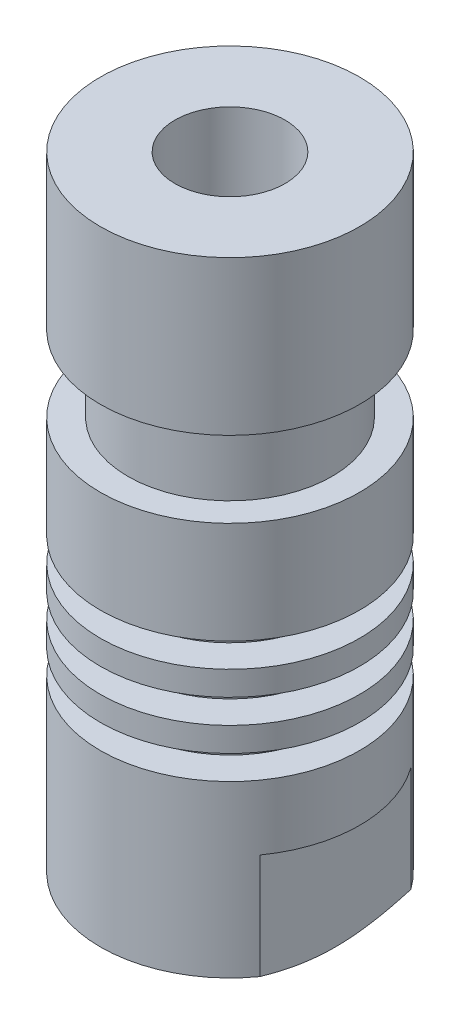
ISO-10303-21;
HEADER;
FILE_DESCRIPTION(('STEP AP214'),'2;1');
FILE_NAME('part.step','',(''),(''),'','','');
FILE_SCHEMA(('AUTOMOTIVE_DESIGN { 1 0 10303 214 1 1 1 1 }'));
ENDSEC;
DATA;
#1=APPLICATION_CONTEXT('core data for automotive mechanical design processes');
#2=APPLICATION_PROTOCOL_DEFINITION('international standard','automotive_design',2000,#1);
#3=PRODUCT_CONTEXT('',#1,'mechanical');
#4=PRODUCT('Part','Part','',(#3));
#5=PRODUCT_RELATED_PRODUCT_CATEGORY('part','',(#4));
#6=PRODUCT_DEFINITION_FORMATION('','',#4);
#7=PRODUCT_DEFINITION_CONTEXT('part definition',#1,'design');
#8=PRODUCT_DEFINITION('design','',#6,#7);
#9=PRODUCT_DEFINITION_SHAPE('','',#8);
#10=(LENGTH_UNIT() NAMED_UNIT(*) SI_UNIT(.MILLI.,.METRE.));
#11=(NAMED_UNIT(*) PLANE_ANGLE_UNIT() SI_UNIT($,.RADIAN.));
#12=(NAMED_UNIT(*) SI_UNIT($,.STERADIAN.) SOLID_ANGLE_UNIT());
#13=UNCERTAINTY_MEASURE_WITH_UNIT(LENGTH_MEASURE(1.E-05),#10,'distance_accuracy_value','');
#14=(GEOMETRIC_REPRESENTATION_CONTEXT(3) GLOBAL_UNCERTAINTY_ASSIGNED_CONTEXT((#13)) GLOBAL_UNIT_ASSIGNED_CONTEXT((#10,
#11,#12)) REPRESENTATION_CONTEXT('',''));
#15=CARTESIAN_POINT('',(0.,0.,0.));
#16=DIRECTION('',(0.,0.,1.));
#17=DIRECTION('',(1.,0.,0.));
#18=AXIS2_PLACEMENT_3D('',#15,#16,#17);
#19=CARTESIAN_POINT('',(0.,1.5,0.));
#20=DIRECTION('',(0.,1.,0.));
#21=DIRECTION('',(0.,0.,1.));
#22=AXIS2_PLACEMENT_3D('',#19,#20,#21);
#23=CONICAL_SURFACE('',#22,7.99999999999999,1.10714871779409);
#24=CARTESIAN_POINT('',(0.,0.,0.));
#25=DIRECTION('',(0.,1.,0.));
#26=DIRECTION('',(0.,0.,1.));
#27=AXIS2_PLACEMENT_3D('',#24,#25,#26);
#28=CIRCLE('',#27,4.99999999999998);
#29=CARTESIAN_POINT('',(0.,0.,4.99999999999998));
#30=VERTEX_POINT('',#29);
#31=EDGE_CURVE('E11',#30,#30,#28,.T.);
#32=ORIENTED_EDGE('',*,*,#31,.T.);
#33=EDGE_LOOP('',(#32));
#34=FACE_BOUND('',#33,.T.);
#35=CARTESIAN_POINT('',(0.,1.5,0.));
#36=DIRECTION('',(0.,1.,0.));
#37=DIRECTION('',(0.,0.,1.));
#38=AXIS2_PLACEMENT_3D('',#35,#36,#37);
#39=CIRCLE('',#38,7.99999999999999);
#40=CARTESIAN_POINT('',(6.49999999999997,1.5,-4.66368952654442));
#41=VERTEX_POINT('',#40);
#42=CARTESIAN_POINT('',(-6.49999999999997,1.5,-4.66368952654442));
#43=VERTEX_POINT('',#42);
#44=EDGE_CURVE('E90',#41,#43,#39,.T.);
#45=ORIENTED_EDGE('',*,*,#44,.F.);
#46=CARTESIAN_POINT('',(6.49999999999999,4.63960517836139,-12.7140020611741));
#47=CARTESIAN_POINT('',(6.49999999999999,4.49493273691476,-12.3889791438294));
#48=CARTESIAN_POINT('',(6.49999999999999,4.35117750702607,-12.0635434352985));
#49=CARTESIAN_POINT('',(6.49999999999999,4.06600795170587,-11.4116234990025));
#50=CARTESIAN_POINT('',(6.49999999999999,3.92459377917146,-11.0851392044028));
#51=CARTESIAN_POINT('',(6.49999999999999,3.64433543055072,-10.4302489102803));
#52=CARTESIAN_POINT('',(6.49999999999999,3.50549732908588,-10.1018403056813));
#53=CARTESIAN_POINT('',(6.49999999999999,3.23142571950738,-9.44352872623451));
#54=CARTESIAN_POINT('',(6.49999999999999,3.09619212071106,-9.11362578922609));
#55=CARTESIAN_POINT('',(6.49999999999999,2.83048289305682,-8.45250376338199));
#56=CARTESIAN_POINT('',(6.49999999999999,2.70000014874712,-8.1212875425723));
#57=CARTESIAN_POINT('',(6.49999999999999,2.44483186701764,-7.45659634827722));
#58=CARTESIAN_POINT('',(6.49999999999999,2.32014667007343,-7.12312124344747));
#59=CARTESIAN_POINT('',(6.49999999999999,2.07840099908306,-6.45372644486896));
#60=CARTESIAN_POINT('',(6.49999999999999,1.96133416663675,-6.11780905674865));
#61=CARTESIAN_POINT('',(6.49999999999999,1.73702665581905,-5.44272397498847));
#62=CARTESIAN_POINT('',(6.49999999999999,1.62978438251793,-5.10355681882979));
#63=CARTESIAN_POINT('',(6.49999999999999,1.50145760944831,-4.66929022803816));
#64=CARTESIAN_POINT('',(6.49999999999999,1.47439812441263,-4.57594563698322));
#65=CARTESIAN_POINT('',(6.49999999999999,1.42132141191772,-4.38896083134469));
#66=CARTESIAN_POINT('',(6.49999999999999,1.39530416853117,-4.29532062130229));
#67=CARTESIAN_POINT('',(6.49999999999999,1.31884649816979,-4.01363447591895));
#68=CARTESIAN_POINT('',(6.49999999999999,1.27009239909997,-3.82513345071698));
#69=CARTESIAN_POINT('',(6.49999999999999,1.13144347216063,-3.25712110004858));
#70=CARTESIAN_POINT('',(6.49999999999999,1.04932049996449,-2.87562365996438));
#71=CARTESIAN_POINT('',(6.49999999999999,0.946261094020701,-2.29977813127616));
#72=CARTESIAN_POINT('',(6.49999999999999,0.915259699355965,-2.10720712065049));
#73=CARTESIAN_POINT('',(6.49999999999999,0.860714592579146,-1.7210183720728));
#74=CARTESIAN_POINT('',(6.49999999999999,0.837170046736164,-1.52740075360301));
#75=CARTESIAN_POINT('',(6.49999999999999,0.798232474629815,-1.13985753736791));
#76=CARTESIAN_POINT('',(6.49999999999999,0.78281812154265,-0.945934097286736));
#77=CARTESIAN_POINT('',(6.49999999999999,0.760510527948946,-0.557594838663115));
#78=CARTESIAN_POINT('',(6.49999999999999,0.753617189046768,-0.36317902583227));
#79=CARTESIAN_POINT('',(6.49999999999999,0.748572275423312,0.0257307608028593));
#80=CARTESIAN_POINT('',(6.49999999999999,0.750419038007415,0.220224712703199));
#81=CARTESIAN_POINT('',(6.49999999999999,0.76278940638265,0.608953775199544));
#82=CARTESIAN_POINT('',(6.49999999999999,0.773314033718197,0.803188852624818));
#83=CARTESIAN_POINT('',(6.49999999999999,0.806501889662758,1.24090602694894));
#84=CARTESIAN_POINT('',(6.49999999999999,0.831590920516133,1.48420561931386));
#85=CARTESIAN_POINT('',(6.49999999999999,0.893852125406739,1.96924724220696));
#86=CARTESIAN_POINT('',(6.49999999999999,0.931025317420886,2.21098913976374));
#87=CARTESIAN_POINT('',(6.49999999999999,1.01604103903786,2.69277716302994));
#88=CARTESIAN_POINT('',(6.49999999999999,1.06389244038228,2.93282170644527));
#89=CARTESIAN_POINT('',(6.49999999999999,1.16871694054054,3.41088019593747));
#90=CARTESIAN_POINT('',(6.49999999999999,1.22568964445531,3.64889422945387));
#91=CARTESIAN_POINT('',(6.49999999999999,1.34820588611418,4.1264246278799));
#92=CARTESIAN_POINT('',(6.49999999999999,1.41386316573231,4.36591159529887));
#93=CARTESIAN_POINT('',(6.49999999999999,1.55170831935892,4.84285142414976));
#94=CARTESIAN_POINT('',(6.49999999999999,1.62389277522808,5.08030527977033));
#95=CARTESIAN_POINT('',(6.49999999999999,1.77367698683179,5.55344813381403));
#96=CARTESIAN_POINT('',(6.49999999999999,1.85127585874316,5.78913741335532));
#97=CARTESIAN_POINT('',(6.49999999999999,2.01097599435672,6.25901728470311));
#98=CARTESIAN_POINT('',(6.49999999999999,2.09307790629008,6.49320765528824));
#99=CARTESIAN_POINT('',(6.49999999999999,2.28703034641471,7.03262988490792));
#100=CARTESIAN_POINT('',(6.49999999999999,2.40021373679549,7.33738166221177));
#101=CARTESIAN_POINT('',(6.49999999999999,2.63161506867892,7.94497276131788));
#102=CARTESIAN_POINT('',(6.49999999999999,2.74983321640616,8.24781200419785));
#103=CARTESIAN_POINT('',(6.49999999999999,2.99028703034095,8.8519169939098));
#104=CARTESIAN_POINT('',(6.49999999999999,3.11252303289466,9.15318260654962));
#105=CARTESIAN_POINT('',(6.49999999999999,3.36022795848007,9.75438363657073));
#106=CARTESIAN_POINT('',(6.49999999999999,3.4856969285348,10.0543190345298));
#107=CARTESIAN_POINT('',(6.49999999999999,3.8662108131295,10.9529295272112));
#108=CARTESIAN_POINT('',(6.49999999999999,4.12517530296346,11.5499439611486));
#109=CARTESIAN_POINT('',(6.49999999999999,4.65016432189855,12.7407935160942));
#110=CARTESIAN_POINT('',(6.49999999999999,4.91618837224115,13.334628849434));
#111=CARTESIAN_POINT('',(6.49999999999999,5.43683739745572,14.4837436524848));
#112=CARTESIAN_POINT('',(6.49999999999999,5.69116368566189,15.0391586745477));
#113=CARTESIAN_POINT('',(6.49999999999999,6.20312748367829,16.148471829484));
#114=CARTESIAN_POINT('',(6.49999999999999,6.46076506083453,16.7023699312269));
#115=CARTESIAN_POINT('',(6.49999999999999,6.97809934492668,17.8080180985776));
#116=CARTESIAN_POINT('',(6.49999999999999,7.23779164660991,18.3597702278274));
#117=CARTESIAN_POINT('',(6.49999999999999,7.75914833515714,19.4623190137403));
#118=CARTESIAN_POINT('',(6.49999999999999,8.02081265352454,20.0131157027799));
#119=CARTESIAN_POINT('',(6.49999999999999,8.28320577924075,20.5635626171586));
#120=B_SPLINE_CURVE_WITH_KNOTS('',3,(#46,#47,#48,#49,#50,#51,#52,#53,#54,#55,#56,#57,#58,#59,
#60,#61,#62,#63,#64,#65,#66,#67,#68,#69,#70,#71,#72,#73,#74,#75,#76,#77,#78,#79,#80,#81,#82,#83,
#84,#85,#86,#87,#88,#89,#90,#91,#92,#93,#94,#95,#96,#97,#98,#99,#100,#101,#102,#103,#104,#105,
#106,#107,#108,#109,#110,#111,#112,#113,#114,#115,#116,#117,#118,#119),.UNSPECIFIED.,.F.,.F.,(4,
2,2,2,2,2,2,2,2,2,2,2,2,2,2,2,2,2,2,2,2,2,2,2,2,2,2,2,2,2,2,2,2,2,2,2,4),(0.,1.06730515758635,
2.13467974924003,3.20431402837473,4.27392137202762,5.34185467005331,6.40985060614332,
7.47694343200911,8.54386271672926,8.83542135077925,9.12697552758702,9.71105511301348,
10.8808525348457,11.4658873460732,12.0508567229673,12.6342839007031,13.2177043413035,
13.8010137979488,14.3843919306593,15.1178129637762,15.8512957967343,16.5853903108169,
17.31945305149,18.0643130987016,18.8087853133975,19.5531362870632,20.2975946957999,
21.2728075860352,22.2480604596634,23.2233951834841,24.1987441014193,26.1509456097113,
28.1030150621006,29.9356240477088,31.7682703646555,33.5977016553134,35.4270696921721),.UNSPECIFIED.);
#121=CARTESIAN_POINT('',(6.49999999999997,1.5,4.66368952654442));
#122=VERTEX_POINT('',#121);
#123=EDGE_CURVE('E75',#122,#41,#120,.F.);
#124=ORIENTED_EDGE('',*,*,#123,.F.);
#125=CARTESIAN_POINT('',(-6.49999999999997,1.5,4.66368952654442));
#126=VERTEX_POINT('',#125);
#127=EDGE_CURVE('E42',#126,#122,#39,.T.);
#128=ORIENTED_EDGE('',*,*,#127,.F.);
#129=CARTESIAN_POINT('',(-6.49999999999999,4.63960517836139,-12.7140020611741));
#130=CARTESIAN_POINT('',(-6.49999999999999,4.49493273691476,-12.3889791438294));
#131=CARTESIAN_POINT('',(-6.49999999999999,4.35117750702607,-12.0635434352985));
#132=CARTESIAN_POINT('',(-6.49999999999999,4.06600795170587,-11.4116234990025));
#133=CARTESIAN_POINT('',(-6.49999999999999,3.92459377917146,-11.0851392044028));
#134=CARTESIAN_POINT('',(-6.49999999999999,3.64433543055072,-10.4302489102803));
#135=CARTESIAN_POINT('',(-6.49999999999999,3.50549732908588,-10.1018403056813));
#136=CARTESIAN_POINT('',(-6.49999999999999,3.23142571950738,-9.44352872623451));
#137=CARTESIAN_POINT('',(-6.49999999999999,3.09619212071106,-9.11362578922609));
#138=CARTESIAN_POINT('',(-6.49999999999999,2.83048289305682,-8.45250376338199));
#139=CARTESIAN_POINT('',(-6.49999999999999,2.70000014874712,-8.1212875425723));
#140=CARTESIAN_POINT('',(-6.49999999999999,2.44483186701764,-7.45659634827722));
#141=CARTESIAN_POINT('',(-6.49999999999999,2.32014667007343,-7.12312124344747));
#142=CARTESIAN_POINT('',(-6.49999999999999,2.07840099908306,-6.45372644486896));
#143=CARTESIAN_POINT('',(-6.49999999999999,1.96133416663675,-6.11780905674865));
#144=CARTESIAN_POINT('',(-6.49999999999999,1.73702665581905,-5.44272397498847));
#145=CARTESIAN_POINT('',(-6.49999999999999,1.62978438251793,-5.10355681882979));
#146=CARTESIAN_POINT('',(-6.49999999999999,1.50145760944831,-4.66929022803816));
#147=CARTESIAN_POINT('',(-6.49999999999999,1.47439812441263,-4.57594563698322));
#148=CARTESIAN_POINT('',(-6.49999999999999,1.42132141191772,-4.38896083134469));
#149=CARTESIAN_POINT('',(-6.49999999999999,1.39530416853117,-4.29532062130229));
#150=CARTESIAN_POINT('',(-6.49999999999999,1.31884649816979,-4.01363447591895));
#151=CARTESIAN_POINT('',(-6.49999999999999,1.27009239909997,-3.82513345071698));
#152=CARTESIAN_POINT('',(-6.49999999999999,1.13144347216063,-3.25712110004858));
#153=CARTESIAN_POINT('',(-6.49999999999999,1.04932049996449,-2.87562365996438));
#154=CARTESIAN_POINT('',(-6.49999999999999,0.946261094020701,-2.29977813127616));
#155=CARTESIAN_POINT('',(-6.49999999999999,0.915259699355965,-2.10720712065049));
#156=CARTESIAN_POINT('',(-6.49999999999999,0.860714592579146,-1.7210183720728));
#157=CARTESIAN_POINT('',(-6.49999999999999,0.837170046736164,-1.52740075360301));
#158=CARTESIAN_POINT('',(-6.49999999999999,0.798232474629815,-1.13985753736791));
#159=CARTESIAN_POINT('',(-6.49999999999999,0.78281812154265,-0.945934097286736));
#160=CARTESIAN_POINT('',(-6.49999999999999,0.760510527948946,-0.557594838663115));
#161=CARTESIAN_POINT('',(-6.49999999999999,0.753617189046768,-0.36317902583227));
#162=CARTESIAN_POINT('',(-6.49999999999999,0.748572275423312,0.0257307608028593));
#163=CARTESIAN_POINT('',(-6.49999999999999,0.750419038007415,0.220224712703199));
#164=CARTESIAN_POINT('',(-6.49999999999999,0.76278940638265,0.608953775199544));
#165=CARTESIAN_POINT('',(-6.49999999999999,0.773314033718197,0.803188852624818));
#166=CARTESIAN_POINT('',(-6.49999999999999,0.806501889662758,1.24090602694894));
#167=CARTESIAN_POINT('',(-6.49999999999999,0.831590920516133,1.48420561931386));
#168=CARTESIAN_POINT('',(-6.49999999999999,0.893852125406739,1.96924724220696));
#169=CARTESIAN_POINT('',(-6.49999999999999,0.931025317420886,2.21098913976374));
#170=CARTESIAN_POINT('',(-6.49999999999999,1.01604103903786,2.69277716302994));
#171=CARTESIAN_POINT('',(-6.49999999999999,1.06389244038228,2.93282170644527));
#172=CARTESIAN_POINT('',(-6.49999999999999,1.16871694054054,3.41088019593747));
#173=CARTESIAN_POINT('',(-6.49999999999999,1.22568964445531,3.64889422945387));
#174=CARTESIAN_POINT('',(-6.49999999999999,1.34820588611418,4.1264246278799));
#175=CARTESIAN_POINT('',(-6.49999999999999,1.41386316573231,4.36591159529887));
#176=CARTESIAN_POINT('',(-6.49999999999999,1.55170831935892,4.84285142414976));
#177=CARTESIAN_POINT('',(-6.49999999999999,1.62389277522808,5.08030527977033));
#178=CARTESIAN_POINT('',(-6.49999999999999,1.77367698683179,5.55344813381403));
#179=CARTESIAN_POINT('',(-6.49999999999999,1.85127585874316,5.78913741335532));
#180=CARTESIAN_POINT('',(-6.49999999999999,2.01097599435672,6.25901728470311));
#181=CARTESIAN_POINT('',(-6.49999999999999,2.09307790629008,6.49320765528824));
#182=CARTESIAN_POINT('',(-6.49999999999999,2.28703034641471,7.03262988490792));
#183=CARTESIAN_POINT('',(-6.49999999999999,2.40021373679549,7.33738166221177));
#184=CARTESIAN_POINT('',(-6.49999999999999,2.63161506867892,7.94497276131788));
#185=CARTESIAN_POINT('',(-6.49999999999999,2.74983321640616,8.24781200419785));
#186=CARTESIAN_POINT('',(-6.49999999999999,2.99028703034095,8.8519169939098));
#187=CARTESIAN_POINT('',(-6.49999999999999,3.11252303289466,9.15318260654962));
#188=CARTESIAN_POINT('',(-6.49999999999999,3.36022795848007,9.75438363657073));
#189=CARTESIAN_POINT('',(-6.49999999999999,3.4856969285348,10.0543190345298));
#190=CARTESIAN_POINT('',(-6.49999999999999,3.8662108131295,10.9529295272112));
#191=CARTESIAN_POINT('',(-6.49999999999999,4.12517530296346,11.5499439611486));
#192=CARTESIAN_POINT('',(-6.49999999999999,4.65016432189855,12.7407935160942));
#193=CARTESIAN_POINT('',(-6.49999999999999,4.91618837224115,13.334628849434));
#194=CARTESIAN_POINT('',(-6.49999999999999,5.43683739745572,14.4837436524848));
#195=CARTESIAN_POINT('',(-6.49999999999999,5.69116368566189,15.0391586745477));
#196=CARTESIAN_POINT('',(-6.49999999999999,6.20312748367829,16.148471829484));
#197=CARTESIAN_POINT('',(-6.49999999999999,6.46076506083453,16.7023699312269));
#198=CARTESIAN_POINT('',(-6.49999999999999,6.97809934492668,17.8080180985776));
#199=CARTESIAN_POINT('',(-6.49999999999999,7.23779164660991,18.3597702278274));
#200=CARTESIAN_POINT('',(-6.49999999999999,7.75914833515714,19.4623190137403));
#201=CARTESIAN_POINT('',(-6.49999999999999,8.02081265352454,20.0131157027799));
#202=CARTESIAN_POINT('',(-6.49999999999999,8.28320577924075,20.5635626171586));
#203=B_SPLINE_CURVE_WITH_KNOTS('',3,(#129,#130,#131,#132,#133,#134,#135,#136,#137,#138,#139,
#140,#141,#142,#143,#144,#145,#146,#147,#148,#149,#150,#151,#152,#153,#154,#155,#156,#157,#158,
#159,#160,#161,#162,#163,#164,#165,#166,#167,#168,#169,#170,#171,#172,#173,#174,#175,#176,#177,
#178,#179,#180,#181,#182,#183,#184,#185,#186,#187,#188,#189,#190,#191,#192,#193,#194,#195,#196,
#197,#198,#199,#200,#201,#202),.UNSPECIFIED.,.F.,.F.,(4,2,2,2,2,2,2,2,2,2,2,2,2,2,2,2,2,2,2,2,2,
2,2,2,2,2,2,2,2,2,2,2,2,2,2,2,4),(0.,1.06730515758635,2.13467974924003,3.20431402837473,
4.27392137202762,5.34185467005331,6.40985060614332,7.47694343200911,8.54386271672926,
8.83542135077925,9.12697552758702,9.71105511301348,10.8808525348457,11.4658873460732,
12.0508567229673,12.6342839007031,13.2177043413035,13.8010137979488,14.3843919306593,
15.1178129637762,15.8512957967343,16.5853903108169,17.31945305149,18.0643130987016,
18.8087853133975,19.5531362870632,20.2975946957999,21.2728075860352,22.2480604596634,
23.2233951834841,24.1987441014193,26.1509456097113,28.1030150621006,29.9356240477088,
31.7682703646555,33.5977016553134,35.4270696921721),.UNSPECIFIED.);
#204=EDGE_CURVE('E95',#43,#126,#203,.T.);
#205=ORIENTED_EDGE('',*,*,#204,.F.);
#206=EDGE_LOOP('',(#45,#124,#128,#205));
#207=FACE_BOUND('',#206,.T.);
#208=ADVANCED_FACE('F34',(#34,#207),#23,.T.);
#209=CARTESIAN_POINT('',(0.,129.407380346339,0.));
#210=DIRECTION('',(0.,1.,0.));
#211=DIRECTION('',(0.,0.,1.));
#212=AXIS2_PLACEMENT_3D('',#209,#210,#211);
#213=CYLINDRICAL_SURFACE('',#212,7.99999999999999);
#214=CARTESIAN_POINT('',(0.,12.,0.));
#215=DIRECTION('',(0.,1.,0.));
#216=DIRECTION('',(0.,0.,1.));
#217=AXIS2_PLACEMENT_3D('',#214,#215,#216);
#218=CIRCLE('',#217,7.99999999999998);
#219=CARTESIAN_POINT('',(0.,12.,7.99999999999998));
#220=VERTEX_POINT('',#219);
#221=EDGE_CURVE('E96',#220,#220,#218,.T.);
#222=ORIENTED_EDGE('',*,*,#221,.F.);
#223=EDGE_LOOP('',(#222));
#224=FACE_BOUND('',#223,.T.);
#225=CARTESIAN_POINT('',(0.,7.99999999999999,0.));
#226=DIRECTION('',(0.,-1.,0.));
#227=DIRECTION('',(0.,0.,-1.));
#228=AXIS2_PLACEMENT_3D('',#225,#226,#227);
#229=CIRCLE('',#228,7.99999999999999);
#230=CARTESIAN_POINT('',(6.49999999999999,7.99999999999999,-4.6636895265444));
#231=VERTEX_POINT('',#230);
#232=CARTESIAN_POINT('',(6.49999999999997,7.99999999999999,4.66368952654442));
#233=VERTEX_POINT('',#232);
#234=EDGE_CURVE('E48',#231,#233,#229,.T.);
#235=ORIENTED_EDGE('',*,*,#234,.F.);
#236=DIRECTION('',(0.,1.,0.));
#237=VECTOR('',#236,1.);
#238=CARTESIAN_POINT('',(6.49999999999997,129.407380346339,-4.66368952654442));
#239=LINE('',#238,#237);
#240=EDGE_CURVE('E78',#231,#41,#239,.F.);
#241=ORIENTED_EDGE('',*,*,#240,.T.);
#242=ORIENTED_EDGE('',*,*,#44,.T.);
#243=DIRECTION('',(0.,1.,0.));
#244=VECTOR('',#243,1.);
#245=CARTESIAN_POINT('',(-6.49999999999997,129.407380346339,-4.66368952654442));
#246=LINE('',#245,#244);
#247=CARTESIAN_POINT('',(-6.49999999999999,7.99999999999999,-4.6636895265444));
#248=VERTEX_POINT('',#247);
#249=EDGE_CURVE('E425',#43,#248,#246,.T.);
#250=ORIENTED_EDGE('',*,*,#249,.T.);
#251=CARTESIAN_POINT('',(0.,7.99999999999998,0.));
#252=DIRECTION('',(0.,-1.,0.));
#253=DIRECTION('',(1.,0.,0.));
#254=AXIS2_PLACEMENT_3D('',#251,#252,#253);
#255=CIRCLE('',#254,7.99999999999999);
#256=CARTESIAN_POINT('',(-6.49999999999999,7.99999999999999,4.6636895265444));
#257=VERTEX_POINT('',#256);
#258=EDGE_CURVE('E426',#257,#248,#255,.T.);
#259=ORIENTED_EDGE('',*,*,#258,.F.);
#260=DIRECTION('',(0.,1.,0.));
#261=VECTOR('',#260,1.);
#262=CARTESIAN_POINT('',(-6.49999999999997,129.407380346339,4.66368952654442));
#263=LINE('',#262,#261);
#264=EDGE_CURVE('E56',#126,#257,#263,.T.);
#265=ORIENTED_EDGE('',*,*,#264,.F.);
#266=ORIENTED_EDGE('',*,*,#127,.T.);
#267=DIRECTION('',(0.,1.,0.));
#268=VECTOR('',#267,1.);
#269=CARTESIAN_POINT('',(6.49999999999997,129.407380346339,4.66368952654442));
#270=LINE('',#269,#268);
#271=EDGE_CURVE('E80',#233,#122,#270,.F.);
#272=ORIENTED_EDGE('',*,*,#271,.F.);
#273=EDGE_LOOP('',(#235,#241,#242,#250,#259,#265,#266,#272));
#274=FACE_BOUND('',#273,.T.);
#275=ADVANCED_FACE('F88',(#224,#274),#213,.T.);
#276=CARTESIAN_POINT('',(0.,0.,0.));
#277=DIRECTION('',(0.,-1.,0.));
#278=DIRECTION('',(0.,0.,-1.));
#279=AXIS2_PLACEMENT_3D('',#276,#277,#278);
#280=PLANE('',#279);
#281=CARTESIAN_POINT('',(0.,0.,0.));
#282=DIRECTION('',(0.,1.,0.));
#283=DIRECTION('',(0.,0.,1.));
#284=AXIS2_PLACEMENT_3D('',#281,#282,#283);
#285=CIRCLE('',#284,3.39999999999999);
#286=CARTESIAN_POINT('',(0.,0.,3.39999999999999));
#287=VERTEX_POINT('',#286);
#288=EDGE_CURVE('E92',#287,#287,#285,.T.);
#289=ORIENTED_EDGE('',*,*,#288,.T.);
#290=EDGE_LOOP('',(#289));
#291=FACE_BOUND('',#290,.T.);
#292=ORIENTED_EDGE('',*,*,#31,.F.);
#293=EDGE_LOOP('',(#292));
#294=FACE_BOUND('',#293,.T.);
#295=ADVANCED_FACE('F36',(#291,#294),#280,.T.);
#296=CARTESIAN_POINT('',(-7.99999999999998,12.,0.));
#297=DIRECTION('',(0.,1.,0.));
#298=DIRECTION('',(0.,0.,1.));
#299=AXIS2_PLACEMENT_3D('',#296,#297,#298);
#300=PLANE('',#299);
#301=ORIENTED_EDGE('',*,*,#221,.T.);
#302=EDGE_LOOP('',(#301));
#303=FACE_BOUND('',#302,.T.);
#304=CARTESIAN_POINT('',(0.,12.,0.));
#305=DIRECTION('',(0.,1.,0.));
#306=DIRECTION('',(0.,0.,1.));
#307=AXIS2_PLACEMENT_3D('',#304,#305,#306);
#308=CIRCLE('',#307,5.99999999999998);
#309=CARTESIAN_POINT('',(0.,12.,5.99999999999998));
#310=VERTEX_POINT('',#309);
#311=EDGE_CURVE('E98',#310,#310,#308,.T.);
#312=ORIENTED_EDGE('',*,*,#311,.F.);
#313=EDGE_LOOP('',(#312));
#314=FACE_BOUND('',#313,.T.);
#315=ADVANCED_FACE('F182',(#303,#314),#300,.T.);
#316=CARTESIAN_POINT('',(0.,129.407380346339,0.));
#317=DIRECTION('',(0.,1.,0.));
#318=DIRECTION('',(0.,0.,1.));
#319=AXIS2_PLACEMENT_3D('',#316,#317,#318);
#320=CYLINDRICAL_SURFACE('',#319,5.99999999999999);
#321=ORIENTED_EDGE('',*,*,#311,.T.);
#322=EDGE_LOOP('',(#321));
#323=FACE_BOUND('',#322,.T.);
#324=CARTESIAN_POINT('',(0.,13.5,0.));
#325=DIRECTION('',(0.,1.,0.));
#326=DIRECTION('',(0.,0.,1.));
#327=AXIS2_PLACEMENT_3D('',#324,#325,#326);
#328=CIRCLE('',#327,6.);
#329=CARTESIAN_POINT('',(0.,13.5,6.));
#330=VERTEX_POINT('',#329);
#331=EDGE_CURVE('E103',#330,#330,#328,.T.);
#332=ORIENTED_EDGE('',*,*,#331,.F.);
#333=EDGE_LOOP('',(#332));
#334=FACE_BOUND('',#333,.T.);
#335=ADVANCED_FACE('F185',(#323,#334),#320,.T.);
#336=CARTESIAN_POINT('',(-6.,13.5,0.));
#337=DIRECTION('',(0.,-1.,0.));
#338=DIRECTION('',(0.,0.,-1.));
#339=AXIS2_PLACEMENT_3D('',#336,#337,#338);
#340=PLANE('',#339);
#341=ORIENTED_EDGE('',*,*,#331,.T.);
#342=EDGE_LOOP('',(#341));
#343=FACE_BOUND('',#342,.T.);
#344=CARTESIAN_POINT('',(0.,13.5,0.));
#345=DIRECTION('',(0.,1.,0.));
#346=DIRECTION('',(0.,0.,1.));
#347=AXIS2_PLACEMENT_3D('',#344,#345,#346);
#348=CIRCLE('',#347,8.);
#349=CARTESIAN_POINT('',(0.,13.5,8.));
#350=VERTEX_POINT('',#349);
#351=EDGE_CURVE('E106',#350,#350,#348,.T.);
#352=ORIENTED_EDGE('',*,*,#351,.F.);
#353=EDGE_LOOP('',(#352));
#354=FACE_BOUND('',#353,.T.);
#355=ADVANCED_FACE('F189',(#343,#354),#340,.T.);
#356=CARTESIAN_POINT('',(0.,129.407380346339,0.));
#357=DIRECTION('',(0.,1.,0.));
#358=DIRECTION('',(0.,0.,1.));
#359=AXIS2_PLACEMENT_3D('',#356,#357,#358);
#360=CYLINDRICAL_SURFACE('',#359,8.);
#361=ORIENTED_EDGE('',*,*,#351,.T.);
#362=EDGE_LOOP('',(#361));
#363=FACE_BOUND('',#362,.T.);
#364=CARTESIAN_POINT('',(0.,15.,0.));
#365=DIRECTION('',(0.,1.,0.));
#366=DIRECTION('',(0.,0.,1.));
#367=AXIS2_PLACEMENT_3D('',#364,#365,#366);
#368=CIRCLE('',#367,8.);
#369=CARTESIAN_POINT('',(0.,15.,8.));
#370=VERTEX_POINT('',#369);
#371=EDGE_CURVE('E109',#370,#370,#368,.T.);
#372=ORIENTED_EDGE('',*,*,#371,.F.);
#373=EDGE_LOOP('',(#372));
#374=FACE_BOUND('',#373,.T.);
#375=ADVANCED_FACE('F193',(#363,#374),#360,.T.);
#376=CARTESIAN_POINT('',(-8.,15.,0.));
#377=DIRECTION('',(0.,1.,0.));
#378=DIRECTION('',(0.,0.,1.));
#379=AXIS2_PLACEMENT_3D('',#376,#377,#378);
#380=PLANE('',#379);
#381=ORIENTED_EDGE('',*,*,#371,.T.);
#382=EDGE_LOOP('',(#381));
#383=FACE_BOUND('',#382,.T.);
#384=CARTESIAN_POINT('',(0.,15.,0.));
#385=DIRECTION('',(0.,1.,0.));
#386=DIRECTION('',(0.,0.,1.));
#387=AXIS2_PLACEMENT_3D('',#384,#385,#386);
#388=CIRCLE('',#387,6.);
#389=CARTESIAN_POINT('',(0.,15.,6.));
#390=VERTEX_POINT('',#389);
#391=EDGE_CURVE('E112',#390,#390,#388,.T.);
#392=ORIENTED_EDGE('',*,*,#391,.F.);
#393=EDGE_LOOP('',(#392));
#394=FACE_BOUND('',#393,.T.);
#395=ADVANCED_FACE('F197',(#383,#394),#380,.T.);
#396=CARTESIAN_POINT('',(0.,129.407380346339,0.));
#397=DIRECTION('',(0.,1.,0.));
#398=DIRECTION('',(0.,0.,1.));
#399=AXIS2_PLACEMENT_3D('',#396,#397,#398);
#400=CYLINDRICAL_SURFACE('',#399,6.);
#401=ORIENTED_EDGE('',*,*,#391,.T.);
#402=EDGE_LOOP('',(#401));
#403=FACE_BOUND('',#402,.T.);
#404=CARTESIAN_POINT('',(0.,16.5,0.));
#405=DIRECTION('',(0.,1.,0.));
#406=DIRECTION('',(0.,0.,1.));
#407=AXIS2_PLACEMENT_3D('',#404,#405,#406);
#408=CIRCLE('',#407,6.);
#409=CARTESIAN_POINT('',(0.,16.5,6.));
#410=VERTEX_POINT('',#409);
#411=EDGE_CURVE('E115',#410,#410,#408,.T.);
#412=ORIENTED_EDGE('',*,*,#411,.F.);
#413=EDGE_LOOP('',(#412));
#414=FACE_BOUND('',#413,.T.);
#415=ADVANCED_FACE('F201',(#403,#414),#400,.T.);
#416=CARTESIAN_POINT('',(-6.,16.5,0.));
#417=DIRECTION('',(0.,-1.,0.));
#418=DIRECTION('',(0.,0.,-1.));
#419=AXIS2_PLACEMENT_3D('',#416,#417,#418);
#420=PLANE('',#419);
#421=ORIENTED_EDGE('',*,*,#411,.T.);
#422=EDGE_LOOP('',(#421));
#423=FACE_BOUND('',#422,.T.);
#424=CARTESIAN_POINT('',(0.,16.5,0.));
#425=DIRECTION('',(0.,1.,0.));
#426=DIRECTION('',(0.,0.,1.));
#427=AXIS2_PLACEMENT_3D('',#424,#425,#426);
#428=CIRCLE('',#427,8.);
#429=CARTESIAN_POINT('',(0.,16.5,8.));
#430=VERTEX_POINT('',#429);
#431=EDGE_CURVE('E118',#430,#430,#428,.T.);
#432=ORIENTED_EDGE('',*,*,#431,.F.);
#433=EDGE_LOOP('',(#432));
#434=FACE_BOUND('',#433,.T.);
#435=ADVANCED_FACE('F205',(#423,#434),#420,.T.);
#436=CARTESIAN_POINT('',(0.,129.407380346339,0.));
#437=DIRECTION('',(0.,1.,0.));
#438=DIRECTION('',(0.,0.,1.));
#439=AXIS2_PLACEMENT_3D('',#436,#437,#438);
#440=CYLINDRICAL_SURFACE('',#439,8.);
#441=ORIENTED_EDGE('',*,*,#431,.T.);
#442=EDGE_LOOP('',(#441));
#443=FACE_BOUND('',#442,.T.);
#444=CARTESIAN_POINT('',(0.,18.,0.));
#445=DIRECTION('',(0.,1.,0.));
#446=DIRECTION('',(0.,0.,1.));
#447=AXIS2_PLACEMENT_3D('',#444,#445,#446);
#448=CIRCLE('',#447,8.);
#449=CARTESIAN_POINT('',(0.,18.,8.));
#450=VERTEX_POINT('',#449);
#451=EDGE_CURVE('E121',#450,#450,#448,.T.);
#452=ORIENTED_EDGE('',*,*,#451,.F.);
#453=EDGE_LOOP('',(#452));
#454=FACE_BOUND('',#453,.T.);
#455=ADVANCED_FACE('F209',(#443,#454),#440,.T.);
#456=CARTESIAN_POINT('',(-8.,18.,0.));
#457=DIRECTION('',(0.,1.,0.));
#458=DIRECTION('',(0.,0.,1.));
#459=AXIS2_PLACEMENT_3D('',#456,#457,#458);
#460=PLANE('',#459);
#461=ORIENTED_EDGE('',*,*,#451,.T.);
#462=EDGE_LOOP('',(#461));
#463=FACE_BOUND('',#462,.T.);
#464=CARTESIAN_POINT('',(0.,18.,0.));
#465=DIRECTION('',(0.,1.,0.));
#466=DIRECTION('',(0.,0.,1.));
#467=AXIS2_PLACEMENT_3D('',#464,#465,#466);
#468=CIRCLE('',#467,6.);
#469=CARTESIAN_POINT('',(0.,18.,6.));
#470=VERTEX_POINT('',#469);
#471=EDGE_CURVE('E124',#470,#470,#468,.T.);
#472=ORIENTED_EDGE('',*,*,#471,.F.);
#473=EDGE_LOOP('',(#472));
#474=FACE_BOUND('',#473,.T.);
#475=ADVANCED_FACE('F213',(#463,#474),#460,.T.);
#476=CARTESIAN_POINT('',(0.,129.407380346339,0.));
#477=DIRECTION('',(0.,1.,0.));
#478=DIRECTION('',(0.,0.,1.));
#479=AXIS2_PLACEMENT_3D('',#476,#477,#478);
#480=CYLINDRICAL_SURFACE('',#479,6.);
#481=ORIENTED_EDGE('',*,*,#471,.T.);
#482=EDGE_LOOP('',(#481));
#483=FACE_BOUND('',#482,.T.);
#484=CARTESIAN_POINT('',(0.,19.5,0.));
#485=DIRECTION('',(0.,1.,0.));
#486=DIRECTION('',(0.,0.,1.));
#487=AXIS2_PLACEMENT_3D('',#484,#485,#486);
#488=CIRCLE('',#487,6.);
#489=CARTESIAN_POINT('',(0.,19.5,6.));
#490=VERTEX_POINT('',#489);
#491=EDGE_CURVE('E127',#490,#490,#488,.T.);
#492=ORIENTED_EDGE('',*,*,#491,.F.);
#493=EDGE_LOOP('',(#492));
#494=FACE_BOUND('',#493,.T.);
#495=ADVANCED_FACE('F217',(#483,#494),#480,.T.);
#496=CARTESIAN_POINT('',(-6.,19.5,0.));
#497=DIRECTION('',(0.,-1.,0.));
#498=DIRECTION('',(0.,0.,-1.));
#499=AXIS2_PLACEMENT_3D('',#496,#497,#498);
#500=PLANE('',#499);
#501=ORIENTED_EDGE('',*,*,#491,.T.);
#502=EDGE_LOOP('',(#501));
#503=FACE_BOUND('',#502,.T.);
#504=CARTESIAN_POINT('',(0.,19.5,0.));
#505=DIRECTION('',(0.,1.,0.));
#506=DIRECTION('',(0.,0.,1.));
#507=AXIS2_PLACEMENT_3D('',#504,#505,#506);
#508=CIRCLE('',#507,8.);
#509=CARTESIAN_POINT('',(0.,19.5,8.));
#510=VERTEX_POINT('',#509);
#511=EDGE_CURVE('E130',#510,#510,#508,.T.);
#512=ORIENTED_EDGE('',*,*,#511,.F.);
#513=EDGE_LOOP('',(#512));
#514=FACE_BOUND('',#513,.T.);
#515=ADVANCED_FACE('F221',(#503,#514),#500,.T.);
#516=CARTESIAN_POINT('',(0.,129.407380346339,0.));
#517=DIRECTION('',(0.,1.,0.));
#518=DIRECTION('',(0.,0.,1.));
#519=AXIS2_PLACEMENT_3D('',#516,#517,#518);
#520=CYLINDRICAL_SURFACE('',#519,7.99999999999999);
#521=ORIENTED_EDGE('',*,*,#511,.T.);
#522=EDGE_LOOP('',(#521));
#523=FACE_BOUND('',#522,.T.);
#524=CARTESIAN_POINT('',(0.,25.8,0.));
#525=DIRECTION('',(0.,1.,0.));
#526=DIRECTION('',(0.,0.,1.));
#527=AXIS2_PLACEMENT_3D('',#524,#525,#526);
#528=CIRCLE('',#527,7.99999999999998);
#529=CARTESIAN_POINT('',(0.,25.8,7.99999999999998));
#530=VERTEX_POINT('',#529);
#531=EDGE_CURVE('E133',#530,#530,#528,.T.);
#532=ORIENTED_EDGE('',*,*,#531,.F.);
#533=EDGE_LOOP('',(#532));
#534=FACE_BOUND('',#533,.T.);
#535=ADVANCED_FACE('F225',(#523,#534),#520,.T.);
#536=CARTESIAN_POINT('',(-7.99999999999998,25.8,0.));
#537=DIRECTION('',(0.,1.,0.));
#538=DIRECTION('',(0.,0.,1.));
#539=AXIS2_PLACEMENT_3D('',#536,#537,#538);
#540=PLANE('',#539);
#541=ORIENTED_EDGE('',*,*,#531,.T.);
#542=EDGE_LOOP('',(#541));
#543=FACE_BOUND('',#542,.T.);
#544=CARTESIAN_POINT('',(0.,25.8,0.));
#545=DIRECTION('',(0.,1.,0.));
#546=DIRECTION('',(0.,0.,1.));
#547=AXIS2_PLACEMENT_3D('',#544,#545,#546);
#548=CIRCLE('',#547,6.3);
#549=CARTESIAN_POINT('',(0.,25.8,6.3));
#550=VERTEX_POINT('',#549);
#551=EDGE_CURVE('E136',#550,#550,#548,.T.);
#552=ORIENTED_EDGE('',*,*,#551,.F.);
#553=EDGE_LOOP('',(#552));
#554=FACE_BOUND('',#553,.T.);
#555=ADVANCED_FACE('F229',(#543,#554),#540,.T.);
#556=CARTESIAN_POINT('',(0.,129.407380346339,0.));
#557=DIRECTION('',(0.,1.,0.));
#558=DIRECTION('',(0.,0.,1.));
#559=AXIS2_PLACEMENT_3D('',#556,#557,#558);
#560=CYLINDRICAL_SURFACE('',#559,6.3);
#561=ORIENTED_EDGE('',*,*,#551,.T.);
#562=EDGE_LOOP('',(#561));
#563=FACE_BOUND('',#562,.T.);
#564=CARTESIAN_POINT('',(0.,30.5,0.));
#565=DIRECTION('',(0.,1.,0.));
#566=DIRECTION('',(0.,0.,1.));
#567=AXIS2_PLACEMENT_3D('',#564,#565,#566);
#568=CIRCLE('',#567,6.3);
#569=CARTESIAN_POINT('',(0.,30.5,6.3));
#570=VERTEX_POINT('',#569);
#571=EDGE_CURVE('E139',#570,#570,#568,.T.);
#572=ORIENTED_EDGE('',*,*,#571,.F.);
#573=EDGE_LOOP('',(#572));
#574=FACE_BOUND('',#573,.T.);
#575=ADVANCED_FACE('F233',(#563,#574),#560,.T.);
#576=CARTESIAN_POINT('',(-6.3,30.5,0.));
#577=DIRECTION('',(0.,-1.,0.));
#578=DIRECTION('',(0.,0.,-1.));
#579=AXIS2_PLACEMENT_3D('',#576,#577,#578);
#580=PLANE('',#579);
#581=ORIENTED_EDGE('',*,*,#571,.T.);
#582=EDGE_LOOP('',(#581));
#583=FACE_BOUND('',#582,.T.);
#584=CARTESIAN_POINT('',(0.,30.5,0.));
#585=DIRECTION('',(0.,1.,0.));
#586=DIRECTION('',(0.,0.,1.));
#587=AXIS2_PLACEMENT_3D('',#584,#585,#586);
#588=CIRCLE('',#587,7.99999999999999);
#589=CARTESIAN_POINT('',(0.,30.5,7.99999999999999));
#590=VERTEX_POINT('',#589);
#591=EDGE_CURVE('E142',#590,#590,#588,.T.);
#592=ORIENTED_EDGE('',*,*,#591,.F.);
#593=EDGE_LOOP('',(#592));
#594=FACE_BOUND('',#593,.T.);
#595=ADVANCED_FACE('F237',(#583,#594),#580,.T.);
#596=CARTESIAN_POINT('',(0.,129.407380346339,0.));
#597=DIRECTION('',(0.,1.,0.));
#598=DIRECTION('',(0.,0.,1.));
#599=AXIS2_PLACEMENT_3D('',#596,#597,#598);
#600=CYLINDRICAL_SURFACE('',#599,7.99999999999999);
#601=ORIENTED_EDGE('',*,*,#591,.T.);
#602=EDGE_LOOP('',(#601));
#603=FACE_BOUND('',#602,.T.);
#604=CARTESIAN_POINT('',(0.,40.,0.));
#605=DIRECTION('',(0.,1.,0.));
#606=DIRECTION('',(0.,0.,1.));
#607=AXIS2_PLACEMENT_3D('',#604,#605,#606);
#608=CIRCLE('',#607,7.99999999999998);
#609=CARTESIAN_POINT('',(0.,40.,7.99999999999998));
#610=VERTEX_POINT('',#609);
#611=EDGE_CURVE('E145',#610,#610,#608,.T.);
#612=ORIENTED_EDGE('',*,*,#611,.F.);
#613=EDGE_LOOP('',(#612));
#614=FACE_BOUND('',#613,.T.);
#615=ADVANCED_FACE('F241',(#603,#614),#600,.T.);
#616=CARTESIAN_POINT('',(-7.99999999999998,40.,0.));
#617=DIRECTION('',(0.,1.,0.));
#618=DIRECTION('',(0.,0.,1.));
#619=AXIS2_PLACEMENT_3D('',#616,#617,#618);
#620=PLANE('',#619);
#621=CARTESIAN_POINT('',(0.,40.,0.));
#622=DIRECTION('',(0.,1.,0.));
#623=DIRECTION('',(0.,0.,1.));
#624=AXIS2_PLACEMENT_3D('',#621,#622,#623);
#625=CIRCLE('',#624,3.39999999999999);
#626=CARTESIAN_POINT('',(0.,40.,3.39999999999999));
#627=VERTEX_POINT('',#626);
#628=EDGE_CURVE('E252',#627,#627,#625,.T.);
#629=ORIENTED_EDGE('',*,*,#628,.F.);
#630=EDGE_LOOP('',(#629));
#631=FACE_BOUND('',#630,.T.);
#632=ORIENTED_EDGE('',*,*,#611,.T.);
#633=EDGE_LOOP('',(#632));
#634=FACE_BOUND('',#633,.T.);
#635=ADVANCED_FACE('F172',(#631,#634),#620,.T.);
#636=CARTESIAN_POINT('',(-6.49999999999999,7.99999999999999,8.001));
#637=DIRECTION('',(-1.,0.,0.));
#638=DIRECTION('',(0.,-1.,0.));
#639=AXIS2_PLACEMENT_3D('',#636,#637,#638);
#640=PLANE('',#639);
#641=ORIENTED_EDGE('',*,*,#204,.T.);
#642=ORIENTED_EDGE('',*,*,#264,.T.);
#643=DIRECTION('',(0.,0.,-1.));
#644=VECTOR('',#643,1.);
#645=CARTESIAN_POINT('',(-6.49999999999999,7.99999999999999,8.001));
#646=LINE('',#645,#644);
#647=EDGE_CURVE('E148',#257,#248,#646,.T.);
#648=ORIENTED_EDGE('',*,*,#647,.T.);
#649=ORIENTED_EDGE('',*,*,#249,.F.);
#650=EDGE_LOOP('',(#641,#642,#648,#649));
#651=FACE_BOUND('',#650,.T.);
#652=ADVANCED_FACE('F157',(#651),#640,.T.);
#653=CARTESIAN_POINT('',(-7.99999999999999,7.99999999999999,8.001));
#654=DIRECTION('',(0.,-1.,0.));
#655=DIRECTION('',(1.,0.,0.));
#656=AXIS2_PLACEMENT_3D('',#653,#654,#655);
#657=PLANE('',#656);
#658=ORIENTED_EDGE('',*,*,#258,.T.);
#659=ORIENTED_EDGE('',*,*,#647,.F.);
#660=EDGE_LOOP('',(#658,#659));
#661=FACE_BOUND('',#660,.T.);
#662=ADVANCED_FACE('F165',(#661),#657,.T.);
#663=CARTESIAN_POINT('',(7.99999999999999,7.99999999999999,8.001));
#664=DIRECTION('',(0.,-1.,0.));
#665=DIRECTION('',(0.,0.,-1.));
#666=AXIS2_PLACEMENT_3D('',#663,#664,#665);
#667=PLANE('',#666);
#668=ORIENTED_EDGE('',*,*,#234,.T.);
#669=DIRECTION('',(0.,0.,-1.));
#670=VECTOR('',#669,1.);
#671=CARTESIAN_POINT('',(6.49999999999999,7.99999999999999,8.001));
#672=LINE('',#671,#670);
#673=EDGE_CURVE('E85',#233,#231,#672,.T.);
#674=ORIENTED_EDGE('',*,*,#673,.T.);
#675=EDGE_LOOP('',(#668,#674));
#676=FACE_BOUND('',#675,.T.);
#677=ADVANCED_FACE('F163',(#676),#667,.T.);
#678=CARTESIAN_POINT('',(6.49999999999999,7.99999999999999,8.001));
#679=DIRECTION('',(1.,0.,0.));
#680=DIRECTION('',(0.,1.,0.));
#681=AXIS2_PLACEMENT_3D('',#678,#679,#680);
#682=PLANE('',#681);
#683=ORIENTED_EDGE('',*,*,#123,.T.);
#684=ORIENTED_EDGE('',*,*,#240,.F.);
#685=ORIENTED_EDGE('',*,*,#673,.F.);
#686=ORIENTED_EDGE('',*,*,#271,.T.);
#687=EDGE_LOOP('',(#683,#684,#685,#686));
#688=FACE_BOUND('',#687,.T.);
#689=ADVANCED_FACE('F77',(#688),#682,.T.);
#690=CARTESIAN_POINT('',(0.,40.,0.));
#691=DIRECTION('',(0.,1.,0.));
#692=DIRECTION('',(0.,0.,1.));
#693=AXIS2_PLACEMENT_3D('',#690,#691,#692);
#694=CYLINDRICAL_SURFACE('',#693,3.39999999999999);
#695=ORIENTED_EDGE('',*,*,#288,.F.);
#696=EDGE_LOOP('',(#695));
#697=FACE_BOUND('',#696,.T.);
#698=ORIENTED_EDGE('',*,*,#628,.T.);
#699=EDGE_LOOP('',(#698));
#700=FACE_BOUND('',#699,.T.);
#701=ADVANCED_FACE('F271',(#697,#700),#694,.F.);
#702=CLOSED_SHELL('',(#208,#275,#295,#315,#335,#355,#375,#395,#415,#435,#455,#475,#495,#515,
#535,#555,#575,#595,#615,#635,#652,#662,#677,#689,#701));
#703=MANIFOLD_SOLID_BREP('B2',#702);
#704=ADVANCED_BREP_SHAPE_REPRESENTATION('',(#18,#703),#14);
#705=SHAPE_DEFINITION_REPRESENTATION(#9,#704);
ENDSEC;
END-ISO-10303-21;
